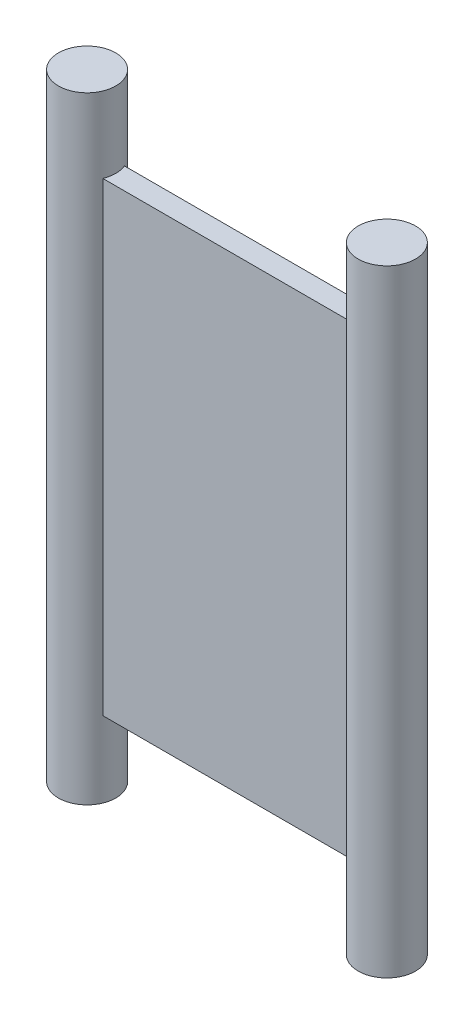
ISO-10303-21;
HEADER;
FILE_DESCRIPTION(('STEP AP214'),'2;1');
FILE_NAME('part.step','',(''),(''),'','','');
FILE_SCHEMA(('AUTOMOTIVE_DESIGN { 1 0 10303 214 1 1 1 1 }'));
ENDSEC;
DATA;
#1=APPLICATION_CONTEXT('core data for automotive mechanical design processes');
#2=APPLICATION_PROTOCOL_DEFINITION('international standard','automotive_design',2000,#1);
#3=PRODUCT_CONTEXT('',#1,'mechanical');
#4=PRODUCT('Part','Part','',(#3));
#5=PRODUCT_RELATED_PRODUCT_CATEGORY('part','',(#4));
#6=PRODUCT_DEFINITION_FORMATION('','',#4);
#7=PRODUCT_DEFINITION_CONTEXT('part definition',#1,'design');
#8=PRODUCT_DEFINITION('design','',#6,#7);
#9=PRODUCT_DEFINITION_SHAPE('','',#8);
#10=(LENGTH_UNIT() NAMED_UNIT(*) SI_UNIT(.MILLI.,.METRE.));
#11=(NAMED_UNIT(*) PLANE_ANGLE_UNIT() SI_UNIT($,.RADIAN.));
#12=(NAMED_UNIT(*) SI_UNIT($,.STERADIAN.) SOLID_ANGLE_UNIT());
#13=UNCERTAINTY_MEASURE_WITH_UNIT(LENGTH_MEASURE(1.E-05),#10,'distance_accuracy_value','');
#14=(GEOMETRIC_REPRESENTATION_CONTEXT(3) GLOBAL_UNCERTAINTY_ASSIGNED_CONTEXT((#13)) GLOBAL_UNIT_ASSIGNED_CONTEXT((#10,
#11,#12)) REPRESENTATION_CONTEXT('',''));
#15=CARTESIAN_POINT('',(0.,0.,0.));
#16=DIRECTION('',(0.,0.,1.));
#17=DIRECTION('',(1.,0.,0.));
#18=AXIS2_PLACEMENT_3D('',#15,#16,#17);
#19=CARTESIAN_POINT('',(6.9265,21.5,0.499999999999999));
#20=DIRECTION('',(0.,0.,-1.));
#21=DIRECTION('',(-1.,0.,0.));
#22=AXIS2_PLACEMENT_3D('',#19,#20,#21);
#23=PLANE('',#22);
#24=DIRECTION('',(0.,-1.,0.));
#25=VECTOR('',#24,1.);
#26=CARTESIAN_POINT('',(5.6994608808192,25.,0.499999999999999));
#27=LINE('',#26,#25);
#28=CARTESIAN_POINT('',(5.6994608808192,21.5,0.499999999999999));
#29=VERTEX_POINT('',#28);
#30=CARTESIAN_POINT('',(5.6994608808192,0.,0.499999999999999));
#31=VERTEX_POINT('',#30);
#32=EDGE_CURVE('E53',#29,#31,#27,.T.);
#33=ORIENTED_EDGE('',*,*,#32,.F.);
#34=DIRECTION('',(1.,0.,0.));
#35=VECTOR('',#34,1.);
#36=CARTESIAN_POINT('',(6.9265,21.5,0.499999999999999));
#37=LINE('',#36,#35);
#38=CARTESIAN_POINT('',(-5.6994608808192,21.5,0.500000000000001));
#39=VERTEX_POINT('',#38);
#40=EDGE_CURVE('E90',#39,#29,#37,.T.);
#41=ORIENTED_EDGE('',*,*,#40,.F.);
#42=DIRECTION('',(0.,-1.,0.));
#43=VECTOR('',#42,1.);
#44=CARTESIAN_POINT('',(-5.6994608808192,25.,0.500000000000001));
#45=LINE('',#44,#43);
#46=CARTESIAN_POINT('',(-5.6994608808192,0.,0.500000000000001));
#47=VERTEX_POINT('',#46);
#48=EDGE_CURVE('E103',#47,#39,#45,.F.);
#49=ORIENTED_EDGE('',*,*,#48,.F.);
#50=DIRECTION('',(1.,0.,0.));
#51=VECTOR('',#50,1.);
#52=CARTESIAN_POINT('',(6.9265,0.,0.499999999999999));
#53=LINE('',#52,#51);
#54=EDGE_CURVE('E91',#47,#31,#53,.T.);
#55=ORIENTED_EDGE('',*,*,#54,.T.);
#56=EDGE_LOOP('',(#33,#41,#49,#55));
#57=FACE_BOUND('',#56,.T.);
#58=ADVANCED_FACE('F39',(#57),#23,.F.);
#59=CARTESIAN_POINT('',(6.9265,21.5,-0.500000000000001));
#60=DIRECTION('',(0.,0.,1.));
#61=DIRECTION('',(1.,0.,0.));
#62=AXIS2_PLACEMENT_3D('',#59,#60,#61);
#63=PLANE('',#62);
#64=DIRECTION('',(0.,-1.,0.));
#65=VECTOR('',#64,1.);
#66=CARTESIAN_POINT('',(5.69946088081919,25.,-0.500000000000001));
#67=LINE('',#66,#65);
#68=CARTESIAN_POINT('',(5.69946088081919,0.,-0.500000000000001));
#69=VERTEX_POINT('',#68);
#70=CARTESIAN_POINT('',(5.69946088081919,21.5,-0.500000000000001));
#71=VERTEX_POINT('',#70);
#72=EDGE_CURVE('E78',#69,#71,#67,.F.);
#73=ORIENTED_EDGE('',*,*,#72,.F.);
#74=DIRECTION('',(-1.,0.,0.));
#75=VECTOR('',#74,1.);
#76=CARTESIAN_POINT('',(6.9265,0.,-0.500000000000001));
#77=LINE('',#76,#75);
#78=CARTESIAN_POINT('',(-5.6994608808192,0.,-0.499999999999999));
#79=VERTEX_POINT('',#78);
#80=EDGE_CURVE('E60',#69,#79,#77,.T.);
#81=ORIENTED_EDGE('',*,*,#80,.T.);
#82=DIRECTION('',(0.,-1.,0.));
#83=VECTOR('',#82,1.);
#84=CARTESIAN_POINT('',(-5.6994608808192,25.,-0.499999999999999));
#85=LINE('',#84,#83);
#86=CARTESIAN_POINT('',(-5.6994608808192,21.5,-0.499999999999999));
#87=VERTEX_POINT('',#86);
#88=EDGE_CURVE('E105',#87,#79,#85,.T.);
#89=ORIENTED_EDGE('',*,*,#88,.F.);
#90=DIRECTION('',(-1.,0.,0.));
#91=VECTOR('',#90,1.);
#92=CARTESIAN_POINT('',(6.9265,21.5,-0.500000000000001));
#93=LINE('',#92,#91);
#94=EDGE_CURVE('E85',#71,#87,#93,.T.);
#95=ORIENTED_EDGE('',*,*,#94,.F.);
#96=EDGE_LOOP('',(#73,#81,#89,#95));
#97=FACE_BOUND('',#96,.T.);
#98=ADVANCED_FACE('F84',(#97),#63,.F.);
#99=CARTESIAN_POINT('',(-6.9265,25.,0.));
#100=DIRECTION('',(0.,-1.,0.));
#101=DIRECTION('',(0.,0.,-1.));
#102=AXIS2_PLACEMENT_3D('',#99,#100,#101);
#103=CYLINDRICAL_SURFACE('',#102,1.325);
#104=CARTESIAN_POINT('',(-6.9265,25.,0.));
#105=DIRECTION('',(0.,1.,0.));
#106=DIRECTION('',(0.,0.,1.));
#107=AXIS2_PLACEMENT_3D('',#104,#105,#106);
#108=CIRCLE('',#107,1.325);
#109=CARTESIAN_POINT('',(-6.9265,25.,1.325));
#110=VERTEX_POINT('',#109);
#111=EDGE_CURVE('E107',#110,#110,#108,.T.);
#112=ORIENTED_EDGE('',*,*,#111,.F.);
#113=EDGE_LOOP('',(#112));
#114=FACE_BOUND('',#113,.T.);
#115=CARTESIAN_POINT('',(-6.9265,-3.5,0.));
#116=DIRECTION('',(0.,1.,0.));
#117=DIRECTION('',(0.,0.,1.));
#118=AXIS2_PLACEMENT_3D('',#115,#116,#117);
#119=CIRCLE('',#118,1.325);
#120=CARTESIAN_POINT('',(-6.9265,-3.5,1.325));
#121=VERTEX_POINT('',#120);
#122=EDGE_CURVE('E108',#121,#121,#119,.T.);
#123=ORIENTED_EDGE('',*,*,#122,.T.);
#124=EDGE_LOOP('',(#123));
#125=FACE_BOUND('',#124,.T.);
#126=ORIENTED_EDGE('',*,*,#48,.T.);
#127=CARTESIAN_POINT('',(-6.9265,21.5,0.));
#128=DIRECTION('',(0.,-1.,0.));
#129=DIRECTION('',(0.,0.,-1.));
#130=AXIS2_PLACEMENT_3D('',#127,#128,#129);
#131=CIRCLE('',#130,1.325);
#132=EDGE_CURVE('E95',#39,#87,#131,.F.);
#133=ORIENTED_EDGE('',*,*,#132,.T.);
#134=ORIENTED_EDGE('',*,*,#88,.T.);
#135=CARTESIAN_POINT('',(-6.9265,0.,0.));
#136=DIRECTION('',(0.,-1.,0.));
#137=DIRECTION('',(0.,0.,-1.));
#138=AXIS2_PLACEMENT_3D('',#135,#136,#137);
#139=CIRCLE('',#138,1.325);
#140=EDGE_CURVE('E46',#47,#79,#139,.F.);
#141=ORIENTED_EDGE('',*,*,#140,.F.);
#142=EDGE_LOOP('',(#126,#133,#134,#141));
#143=FACE_BOUND('',#142,.T.);
#144=ADVANCED_FACE('F138',(#114,#125,#143),#103,.T.);
#145=CARTESIAN_POINT('',(-6.9265,25.,0.));
#146=DIRECTION('',(0.,1.,0.));
#147=DIRECTION('',(0.,0.,1.));
#148=AXIS2_PLACEMENT_3D('',#145,#146,#147);
#149=PLANE('',#148);
#150=ORIENTED_EDGE('',*,*,#111,.T.);
#151=EDGE_LOOP('',(#150));
#152=FACE_BOUND('',#151,.T.);
#153=ADVANCED_FACE('F144',(#152),#149,.T.);
#154=CARTESIAN_POINT('',(-6.9265,-3.5,0.));
#155=DIRECTION('',(0.,1.,0.));
#156=DIRECTION('',(0.,0.,1.));
#157=AXIS2_PLACEMENT_3D('',#154,#155,#156);
#158=PLANE('',#157);
#159=ORIENTED_EDGE('',*,*,#122,.F.);
#160=EDGE_LOOP('',(#159));
#161=FACE_BOUND('',#160,.T.);
#162=ADVANCED_FACE('F150',(#161),#158,.F.);
#163=CARTESIAN_POINT('',(0.,21.5,0.));
#164=DIRECTION('',(0.,-1.,0.));
#165=DIRECTION('',(0.,0.,-1.));
#166=AXIS2_PLACEMENT_3D('',#163,#164,#165);
#167=PLANE('',#166);
#168=CARTESIAN_POINT('',(6.9265,21.5,0.));
#169=DIRECTION('',(0.,-1.,0.));
#170=DIRECTION('',(0.,0.,-1.));
#171=AXIS2_PLACEMENT_3D('',#168,#169,#170);
#172=CIRCLE('',#171,1.325);
#173=EDGE_CURVE('E111',#71,#29,#172,.F.);
#174=ORIENTED_EDGE('',*,*,#173,.F.);
#175=ORIENTED_EDGE('',*,*,#94,.T.);
#176=ORIENTED_EDGE('',*,*,#132,.F.);
#177=ORIENTED_EDGE('',*,*,#40,.T.);
#178=EDGE_LOOP('',(#174,#175,#176,#177));
#179=FACE_BOUND('',#178,.T.);
#180=ADVANCED_FACE('F141',(#179),#167,.F.);
#181=CARTESIAN_POINT('',(0.,0.,0.));
#182=DIRECTION('',(0.,-1.,0.));
#183=DIRECTION('',(0.,0.,-1.));
#184=AXIS2_PLACEMENT_3D('',#181,#182,#183);
#185=PLANE('',#184);
#186=ORIENTED_EDGE('',*,*,#80,.F.);
#187=CARTESIAN_POINT('',(6.9265,0.,0.));
#188=DIRECTION('',(0.,-1.,0.));
#189=DIRECTION('',(0.,0.,-1.));
#190=AXIS2_PLACEMENT_3D('',#187,#188,#189);
#191=CIRCLE('',#190,1.325);
#192=EDGE_CURVE('E11',#69,#31,#191,.F.);
#193=ORIENTED_EDGE('',*,*,#192,.T.);
#194=ORIENTED_EDGE('',*,*,#54,.F.);
#195=ORIENTED_EDGE('',*,*,#140,.T.);
#196=EDGE_LOOP('',(#186,#193,#194,#195));
#197=FACE_BOUND('',#196,.T.);
#198=ADVANCED_FACE('F89',(#197),#185,.T.);
#199=CARTESIAN_POINT('',(6.9265,25.,0.));
#200=DIRECTION('',(0.,-1.,0.));
#201=DIRECTION('',(0.,0.,-1.));
#202=AXIS2_PLACEMENT_3D('',#199,#200,#201);
#203=CYLINDRICAL_SURFACE('',#202,1.325);
#204=CARTESIAN_POINT('',(6.9265,25.,0.));
#205=DIRECTION('',(0.,1.,0.));
#206=DIRECTION('',(0.,0.,1.));
#207=AXIS2_PLACEMENT_3D('',#204,#205,#206);
#208=CIRCLE('',#207,1.325);
#209=CARTESIAN_POINT('',(6.9265,25.,1.325));
#210=VERTEX_POINT('',#209);
#211=EDGE_CURVE('E116',#210,#210,#208,.T.);
#212=ORIENTED_EDGE('',*,*,#211,.F.);
#213=EDGE_LOOP('',(#212));
#214=FACE_BOUND('',#213,.T.);
#215=CARTESIAN_POINT('',(6.9265,-3.5,0.));
#216=DIRECTION('',(0.,1.,0.));
#217=DIRECTION('',(0.,0.,1.));
#218=AXIS2_PLACEMENT_3D('',#215,#216,#217);
#219=CIRCLE('',#218,1.325);
#220=CARTESIAN_POINT('',(6.9265,-3.5,1.325));
#221=VERTEX_POINT('',#220);
#222=EDGE_CURVE('E86',#221,#221,#219,.T.);
#223=ORIENTED_EDGE('',*,*,#222,.T.);
#224=EDGE_LOOP('',(#223));
#225=FACE_BOUND('',#224,.T.);
#226=ORIENTED_EDGE('',*,*,#72,.T.);
#227=ORIENTED_EDGE('',*,*,#173,.T.);
#228=ORIENTED_EDGE('',*,*,#32,.T.);
#229=ORIENTED_EDGE('',*,*,#192,.F.);
#230=EDGE_LOOP('',(#226,#227,#228,#229));
#231=FACE_BOUND('',#230,.T.);
#232=ADVANCED_FACE('F77',(#214,#225,#231),#203,.T.);
#233=CARTESIAN_POINT('',(6.9265,25.,0.));
#234=DIRECTION('',(0.,1.,0.));
#235=DIRECTION('',(0.,0.,1.));
#236=AXIS2_PLACEMENT_3D('',#233,#234,#235);
#237=PLANE('',#236);
#238=ORIENTED_EDGE('',*,*,#211,.T.);
#239=EDGE_LOOP('',(#238));
#240=FACE_BOUND('',#239,.T.);
#241=ADVANCED_FACE('F125',(#240),#237,.T.);
#242=CARTESIAN_POINT('',(6.9265,-3.5,0.));
#243=DIRECTION('',(0.,1.,0.));
#244=DIRECTION('',(0.,0.,1.));
#245=AXIS2_PLACEMENT_3D('',#242,#243,#244);
#246=PLANE('',#245);
#247=ORIENTED_EDGE('',*,*,#222,.F.);
#248=EDGE_LOOP('',(#247));
#249=FACE_BOUND('',#248,.T.);
#250=ADVANCED_FACE('F123',(#249),#246,.F.);
#251=CLOSED_SHELL('',(#58,#98,#144,#153,#162,#180,#198,#232,#241,#250));
#252=MANIFOLD_SOLID_BREP('B2',#251);
#253=ADVANCED_BREP_SHAPE_REPRESENTATION('',(#18,#252),#14);
#254=SHAPE_DEFINITION_REPRESENTATION(#9,#253);
ENDSEC;
END-ISO-10303-21;
